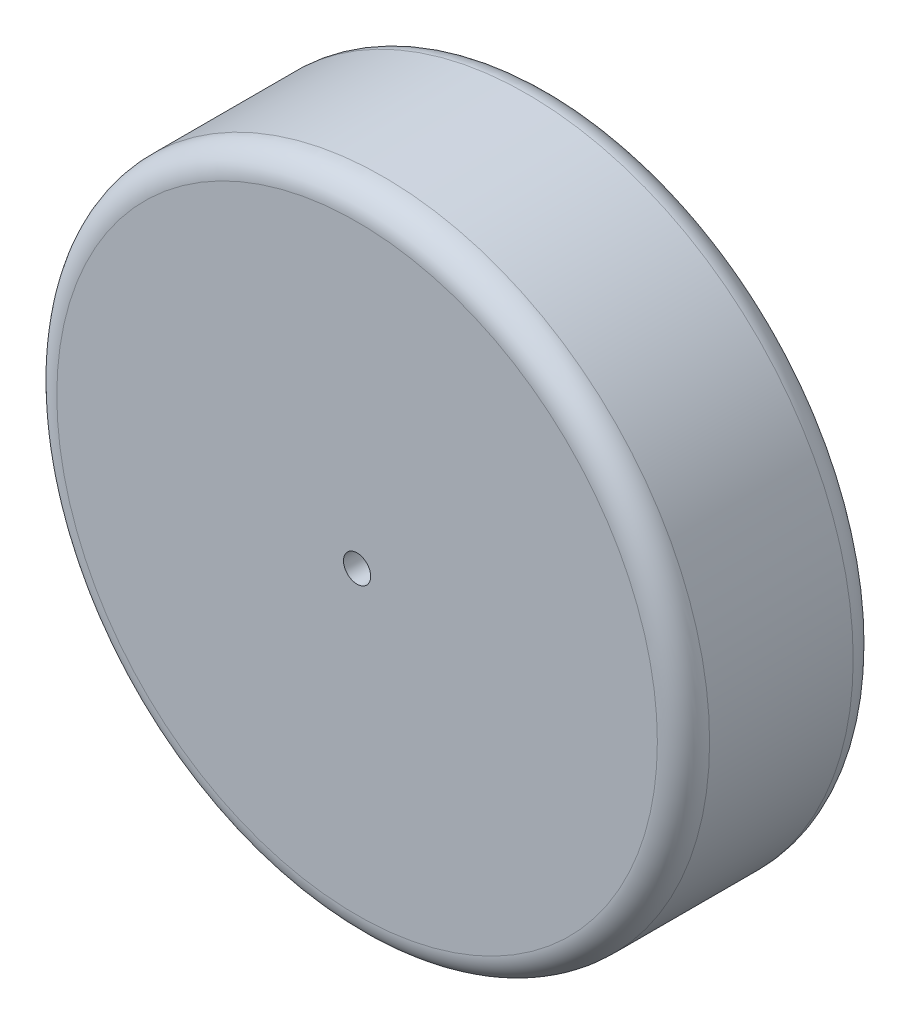
ISO-10303-21;
HEADER;
FILE_DESCRIPTION(('STEP AP214'),'2;1');
FILE_NAME('part.step','',(''),(''),'','','');
FILE_SCHEMA(('AUTOMOTIVE_DESIGN { 1 0 10303 214 1 1 1 1 }'));
ENDSEC;
DATA;
#1=APPLICATION_CONTEXT('core data for automotive mechanical design processes');
#2=APPLICATION_PROTOCOL_DEFINITION('international standard','automotive_design',2000,#1);
#3=PRODUCT_CONTEXT('',#1,'mechanical');
#4=PRODUCT('Part','Part','',(#3));
#5=PRODUCT_RELATED_PRODUCT_CATEGORY('part','',(#4));
#6=PRODUCT_DEFINITION_FORMATION('','',#4);
#7=PRODUCT_DEFINITION_CONTEXT('part definition',#1,'design');
#8=PRODUCT_DEFINITION('design','',#6,#7);
#9=PRODUCT_DEFINITION_SHAPE('','',#8);
#10=(LENGTH_UNIT() NAMED_UNIT(*) SI_UNIT(.MILLI.,.METRE.));
#11=(NAMED_UNIT(*) PLANE_ANGLE_UNIT() SI_UNIT($,.RADIAN.));
#12=(NAMED_UNIT(*) SI_UNIT($,.STERADIAN.) SOLID_ANGLE_UNIT());
#13=UNCERTAINTY_MEASURE_WITH_UNIT(LENGTH_MEASURE(1.E-05),#10,'distance_accuracy_value','');
#14=(GEOMETRIC_REPRESENTATION_CONTEXT(3) GLOBAL_UNCERTAINTY_ASSIGNED_CONTEXT((#13)) GLOBAL_UNIT_ASSIGNED_CONTEXT((#10,
#11,#12)) REPRESENTATION_CONTEXT('',''));
#15=CARTESIAN_POINT('',(0.,0.,0.));
#16=DIRECTION('',(0.,0.,1.));
#17=DIRECTION('',(1.,0.,0.));
#18=AXIS2_PLACEMENT_3D('',#15,#16,#17);
#19=CARTESIAN_POINT('',(0.,0.,15.));
#20=DIRECTION('',(0.,0.,-1.));
#21=DIRECTION('',(-1.,0.,0.));
#22=AXIS2_PLACEMENT_3D('',#19,#20,#21);
#23=CYLINDRICAL_SURFACE('',#22,25.);
#24=CARTESIAN_POINT('',(0.,0.,13.));
#25=DIRECTION('',(0.,0.,1.));
#26=DIRECTION('',(1.,0.,0.));
#27=AXIS2_PLACEMENT_3D('',#24,#25,#26);
#28=CIRCLE('',#27,25.);
#29=CARTESIAN_POINT('',(25.,0.,13.));
#30=VERTEX_POINT('',#29);
#31=EDGE_CURVE('E51',#30,#30,#28,.F.);
#32=ORIENTED_EDGE('',*,*,#31,.T.);
#33=EDGE_LOOP('',(#32));
#34=FACE_BOUND('',#33,.T.);
#35=CARTESIAN_POINT('',(0.,0.,2.));
#36=DIRECTION('',(0.,0.,1.));
#37=DIRECTION('',(1.,0.,0.));
#38=AXIS2_PLACEMENT_3D('',#35,#36,#37);
#39=CIRCLE('',#38,25.);
#40=CARTESIAN_POINT('',(25.,0.,2.));
#41=VERTEX_POINT('',#40);
#42=EDGE_CURVE('E56',#41,#41,#39,.T.);
#43=ORIENTED_EDGE('',*,*,#42,.T.);
#44=EDGE_LOOP('',(#43));
#45=FACE_BOUND('',#44,.T.);
#46=ADVANCED_FACE('F43',(#34,#45),#23,.T.);
#47=CARTESIAN_POINT('',(0.,0.,15.));
#48=DIRECTION('',(0.,0.,1.));
#49=DIRECTION('',(1.,0.,0.));
#50=AXIS2_PLACEMENT_3D('',#47,#48,#49);
#51=PLANE('',#50);
#52=CARTESIAN_POINT('',(0.,0.,15.));
#53=DIRECTION('',(0.,0.,1.));
#54=DIRECTION('',(1.,0.,0.));
#55=AXIS2_PLACEMENT_3D('',#52,#53,#54);
#56=CIRCLE('',#55,1.03999999999999);
#57=CARTESIAN_POINT('',(1.03999999999999,0.,15.));
#58=VERTEX_POINT('',#57);
#59=EDGE_CURVE('E68',#58,#58,#56,.T.);
#60=ORIENTED_EDGE('',*,*,#59,.F.);
#61=EDGE_LOOP('',(#60));
#62=FACE_BOUND('',#61,.T.);
#63=CARTESIAN_POINT('',(0.,0.,15.));
#64=DIRECTION('',(0.,0.,1.));
#65=DIRECTION('',(1.,0.,0.));
#66=AXIS2_PLACEMENT_3D('',#63,#64,#65);
#67=CIRCLE('',#66,23.);
#68=CARTESIAN_POINT('',(23.,0.,15.));
#69=VERTEX_POINT('',#68);
#70=EDGE_CURVE('E61',#69,#69,#67,.T.);
#71=ORIENTED_EDGE('',*,*,#70,.T.);
#72=EDGE_LOOP('',(#71));
#73=FACE_BOUND('',#72,.T.);
#74=ADVANCED_FACE('F84',(#62,#73),#51,.T.);
#75=CARTESIAN_POINT('',(0.,0.,0.));
#76=DIRECTION('',(0.,0.,1.));
#77=DIRECTION('',(1.,0.,0.));
#78=AXIS2_PLACEMENT_3D('',#75,#76,#77);
#79=PLANE('',#78);
#80=CARTESIAN_POINT('',(0.,0.,0.));
#81=DIRECTION('',(0.,0.,1.));
#82=DIRECTION('',(1.,0.,0.));
#83=AXIS2_PLACEMENT_3D('',#80,#81,#82);
#84=CIRCLE('',#83,1.03999999999999);
#85=CARTESIAN_POINT('',(1.03999999999999,0.,0.));
#86=VERTEX_POINT('',#85);
#87=EDGE_CURVE('E67',#86,#86,#84,.T.);
#88=ORIENTED_EDGE('',*,*,#87,.T.);
#89=EDGE_LOOP('',(#88));
#90=FACE_BOUND('',#89,.T.);
#91=CARTESIAN_POINT('',(0.,0.,0.));
#92=DIRECTION('',(0.,0.,1.));
#93=DIRECTION('',(1.,0.,0.));
#94=AXIS2_PLACEMENT_3D('',#91,#92,#93);
#95=CIRCLE('',#94,23.);
#96=CARTESIAN_POINT('',(23.,0.,0.));
#97=VERTEX_POINT('',#96);
#98=EDGE_CURVE('E10',#97,#97,#95,.F.);
#99=ORIENTED_EDGE('',*,*,#98,.T.);
#100=EDGE_LOOP('',(#99));
#101=FACE_BOUND('',#100,.T.);
#102=ADVANCED_FACE('F76',(#90,#101),#79,.F.);
#103=CARTESIAN_POINT('',(0.,0.,13.));
#104=DIRECTION('',(0.,0.,1.));
#105=DIRECTION('',(1.,0.,0.));
#106=AXIS2_PLACEMENT_3D('',#103,#104,#105);
#107=TOROIDAL_SURFACE('',#106,23.,2.);
#108=ORIENTED_EDGE('',*,*,#31,.F.);
#109=EDGE_LOOP('',(#108));
#110=FACE_BOUND('',#109,.T.);
#111=ORIENTED_EDGE('',*,*,#70,.F.);
#112=EDGE_LOOP('',(#111));
#113=FACE_BOUND('',#112,.T.);
#114=ADVANCED_FACE('F90',(#110,#113),#107,.T.);
#115=CARTESIAN_POINT('',(0.,0.,2.));
#116=DIRECTION('',(0.,0.,1.));
#117=DIRECTION('',(1.,0.,0.));
#118=AXIS2_PLACEMENT_3D('',#115,#116,#117);
#119=TOROIDAL_SURFACE('',#118,23.,2.);
#120=ORIENTED_EDGE('',*,*,#98,.F.);
#121=EDGE_LOOP('',(#120));
#122=FACE_BOUND('',#121,.T.);
#123=ORIENTED_EDGE('',*,*,#42,.F.);
#124=EDGE_LOOP('',(#123));
#125=FACE_BOUND('',#124,.T.);
#126=ADVANCED_FACE('F45',(#122,#125),#119,.T.);
#127=CARTESIAN_POINT('',(0.,0.,0.));
#128=DIRECTION('',(0.,0.,1.));
#129=DIRECTION('',(1.,0.,0.));
#130=AXIS2_PLACEMENT_3D('',#127,#128,#129);
#131=CYLINDRICAL_SURFACE('',#130,1.03999999999999);
#132=ORIENTED_EDGE('',*,*,#87,.F.);
#133=EDGE_LOOP('',(#132));
#134=FACE_BOUND('',#133,.T.);
#135=ORIENTED_EDGE('',*,*,#59,.T.);
#136=EDGE_LOOP('',(#135));
#137=FACE_BOUND('',#136,.T.);
#138=ADVANCED_FACE('F78',(#134,#137),#131,.F.);
#139=CLOSED_SHELL('',(#46,#74,#102,#114,#126,#138));
#140=MANIFOLD_SOLID_BREP('B2',#139);
#141=ADVANCED_BREP_SHAPE_REPRESENTATION('',(#18,#140),#14);
#142=SHAPE_DEFINITION_REPRESENTATION(#9,#141);
ENDSEC;
END-ISO-10303-21;
